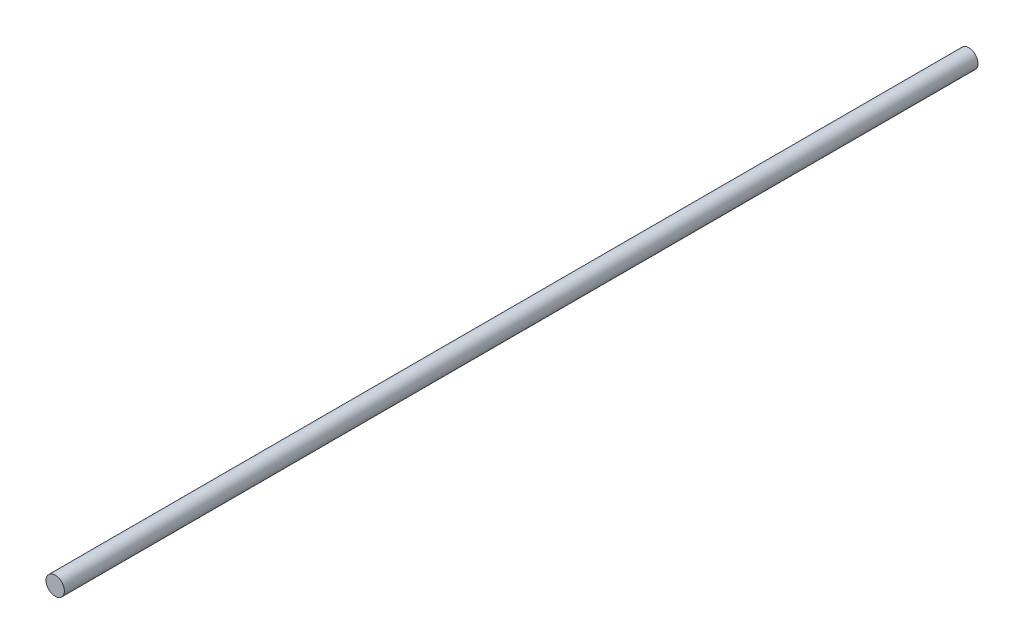
ISO-10303-21;
HEADER;
FILE_DESCRIPTION(('STEP AP214'),'2;1');
FILE_NAME('part.step','',(''),(''),'','','');
FILE_SCHEMA(('AUTOMOTIVE_DESIGN { 1 0 10303 214 1 1 1 1 }'));
ENDSEC;
DATA;
#1=APPLICATION_CONTEXT('core data for automotive mechanical design processes');
#2=APPLICATION_PROTOCOL_DEFINITION('international standard','automotive_design',2000,#1);
#3=PRODUCT_CONTEXT('',#1,'mechanical');
#4=PRODUCT('Part','Part','',(#3));
#5=PRODUCT_RELATED_PRODUCT_CATEGORY('part','',(#4));
#6=PRODUCT_DEFINITION_FORMATION('','',#4);
#7=PRODUCT_DEFINITION_CONTEXT('part definition',#1,'design');
#8=PRODUCT_DEFINITION('design','',#6,#7);
#9=PRODUCT_DEFINITION_SHAPE('','',#8);
#10=(LENGTH_UNIT() NAMED_UNIT(*) SI_UNIT(.MILLI.,.METRE.));
#11=(NAMED_UNIT(*) PLANE_ANGLE_UNIT() SI_UNIT($,.RADIAN.));
#12=(NAMED_UNIT(*) SI_UNIT($,.STERADIAN.) SOLID_ANGLE_UNIT());
#13=UNCERTAINTY_MEASURE_WITH_UNIT(LENGTH_MEASURE(1.E-05),#10,'distance_accuracy_value','');
#14=(GEOMETRIC_REPRESENTATION_CONTEXT(3) GLOBAL_UNCERTAINTY_ASSIGNED_CONTEXT((#13)) GLOBAL_UNIT_ASSIGNED_CONTEXT((#10,
#11,#12)) REPRESENTATION_CONTEXT('',''));
#15=CARTESIAN_POINT('',(0.,0.,0.));
#16=DIRECTION('',(0.,0.,1.));
#17=DIRECTION('',(1.,0.,0.));
#18=AXIS2_PLACEMENT_3D('',#15,#16,#17);
#19=CARTESIAN_POINT('',(0.,0.,7.80000019073498));
#20=DIRECTION('',(0.,0.,-1.));
#21=DIRECTION('',(0.,1.,0.));
#22=AXIS2_PLACEMENT_3D('',#19,#20,#21);
#23=PLANE('',#22);
#24=CARTESIAN_POINT('',(0.,0.,7.80000019073498));
#25=DIRECTION('',(0.,0.,1.));
#26=DIRECTION('',(0.,-1.,0.));
#27=AXIS2_PLACEMENT_3D('',#24,#25,#26);
#28=CIRCLE('',#27,4.00000000000001);
#29=CARTESIAN_POINT('',(0.,-4.00000000000001,7.80000019073498));
#30=VERTEX_POINT('',#29);
#31=EDGE_CURVE('E10',#30,#30,#28,.T.);
#32=ORIENTED_EDGE('',*,*,#31,.T.);
#33=EDGE_LOOP('',(#32));
#34=FACE_BOUND('',#33,.T.);
#35=ADVANCED_FACE('F32',(#34),#23,.F.);
#36=CARTESIAN_POINT('',(0.,0.,7.80000019073498));
#37=DIRECTION('',(0.,0.,1.));
#38=DIRECTION('',(0.,-1.,0.));
#39=AXIS2_PLACEMENT_3D('',#36,#37,#38);
#40=CYLINDRICAL_SURFACE('',#39,3.99999999999985);
#41=ORIENTED_EDGE('',*,*,#31,.F.);
#42=EDGE_LOOP('',(#41));
#43=FACE_BOUND('',#42,.T.);
#44=CARTESIAN_POINT('',(0.,3.03579087218282E-13,-390.003194168601));
#45=DIRECTION('',(0.,0.,1.));
#46=DIRECTION('',(0.,-1.,0.));
#47=AXIS2_PLACEMENT_3D('',#44,#45,#46);
#48=CIRCLE('',#47,3.9999999999997);
#49=CARTESIAN_POINT('',(0.,-3.99999999999939,-390.003194168601));
#50=VERTEX_POINT('',#49);
#51=EDGE_CURVE('E38',#50,#50,#48,.T.);
#52=ORIENTED_EDGE('',*,*,#51,.T.);
#53=EDGE_LOOP('',(#52));
#54=FACE_BOUND('',#53,.T.);
#55=ADVANCED_FACE('F44',(#43,#54),#40,.T.);
#56=CARTESIAN_POINT('',(0.,-1.44849410244063E-13,-390.003194168601));
#57=DIRECTION('',(0.,0.,1.));
#58=DIRECTION('',(0.,-1.,0.));
#59=AXIS2_PLACEMENT_3D('',#56,#57,#58);
#60=PLANE('',#59);
#61=ORIENTED_EDGE('',*,*,#51,.F.);
#62=EDGE_LOOP('',(#61));
#63=FACE_BOUND('',#62,.T.);
#64=ADVANCED_FACE('F46',(#63),#60,.F.);
#65=CLOSED_SHELL('',(#35,#55,#64));
#66=MANIFOLD_SOLID_BREP('B2',#65);
#67=ADVANCED_BREP_SHAPE_REPRESENTATION('',(#18,#66),#14);
#68=SHAPE_DEFINITION_REPRESENTATION(#9,#67);
ENDSEC;
END-ISO-10303-21;
